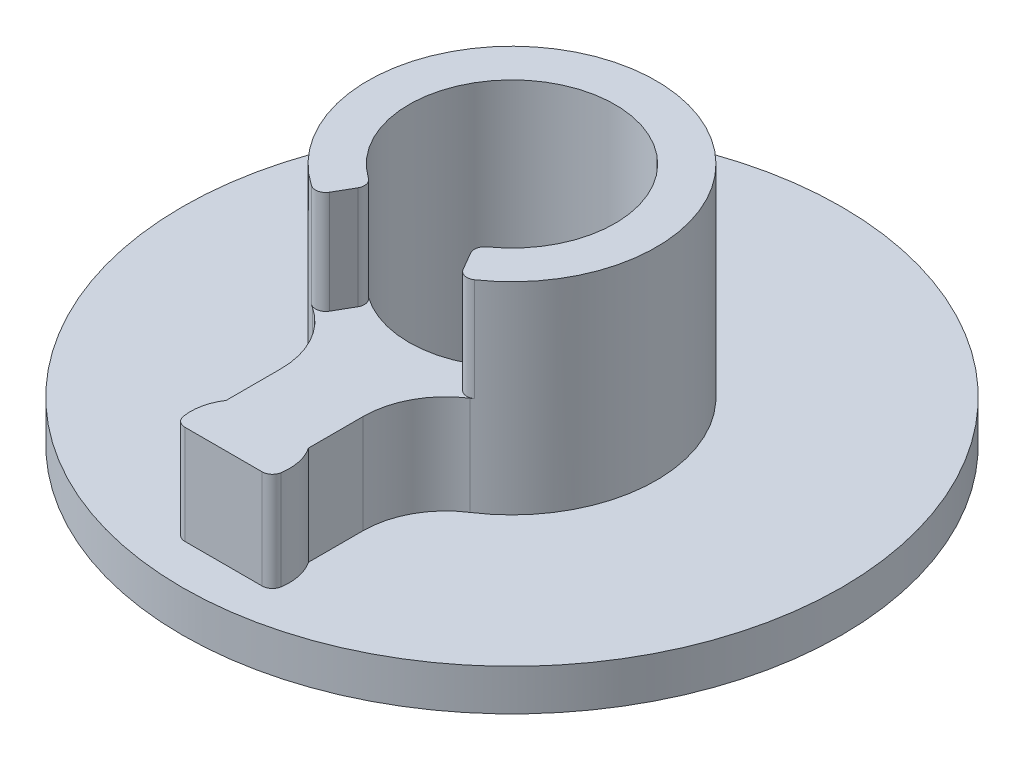
ISO-10303-21;
HEADER;
FILE_DESCRIPTION(('STEP AP214'),'2;1');
FILE_NAME('part.step','',(''),(''),'','','');
FILE_SCHEMA(('AUTOMOTIVE_DESIGN { 1 0 10303 214 1 1 1 1 }'));
ENDSEC;
DATA;
#1=APPLICATION_CONTEXT('core data for automotive mechanical design processes');
#2=APPLICATION_PROTOCOL_DEFINITION('international standard','automotive_design',2000,#1);
#3=PRODUCT_CONTEXT('',#1,'mechanical');
#4=PRODUCT('Part','Part','',(#3));
#5=PRODUCT_RELATED_PRODUCT_CATEGORY('part','',(#4));
#6=PRODUCT_DEFINITION_FORMATION('','',#4);
#7=PRODUCT_DEFINITION_CONTEXT('part definition',#1,'design');
#8=PRODUCT_DEFINITION('design','',#6,#7);
#9=PRODUCT_DEFINITION_SHAPE('','',#8);
#10=(LENGTH_UNIT() NAMED_UNIT(*) SI_UNIT(.MILLI.,.METRE.));
#11=(NAMED_UNIT(*) PLANE_ANGLE_UNIT() SI_UNIT($,.RADIAN.));
#12=(NAMED_UNIT(*) SI_UNIT($,.STERADIAN.) SOLID_ANGLE_UNIT());
#13=UNCERTAINTY_MEASURE_WITH_UNIT(LENGTH_MEASURE(1.E-05),#10,'distance_accuracy_value','');
#14=(GEOMETRIC_REPRESENTATION_CONTEXT(3) GLOBAL_UNCERTAINTY_ASSIGNED_CONTEXT((#13)) GLOBAL_UNIT_ASSIGNED_CONTEXT((#10,
#11,#12)) REPRESENTATION_CONTEXT('',''));
#15=CARTESIAN_POINT('',(0.,0.,0.));
#16=DIRECTION('',(0.,0.,1.));
#17=DIRECTION('',(1.,0.,0.));
#18=AXIS2_PLACEMENT_3D('',#15,#16,#17);
#19=CARTESIAN_POINT('',(0.,-0.1,0.));
#20=DIRECTION('',(0.,-1.,0.));
#21=DIRECTION('',(0.,0.,-1.));
#22=AXIS2_PLACEMENT_3D('',#19,#20,#21);
#23=CYLINDRICAL_SURFACE('',#22,3.25);
#24=CARTESIAN_POINT('',(0.,-0.1,0.));
#25=DIRECTION('',(0.,-1.,0.));
#26=DIRECTION('',(0.,0.,-1.));
#27=AXIS2_PLACEMENT_3D('',#24,#25,#26);
#28=CIRCLE('',#27,3.25);
#29=CARTESIAN_POINT('',(0.,-0.1,-3.25));
#30=VERTEX_POINT('',#29);
#31=EDGE_CURVE('E11',#30,#30,#28,.T.);
#32=ORIENTED_EDGE('',*,*,#31,.T.);
#33=EDGE_LOOP('',(#32));
#34=FACE_BOUND('',#33,.T.);
#35=CARTESIAN_POINT('',(0.,-1.5,0.));
#36=DIRECTION('',(0.,-1.,0.));
#37=DIRECTION('',(0.,0.,-1.));
#38=AXIS2_PLACEMENT_3D('',#35,#36,#37);
#39=CIRCLE('',#38,3.25);
#40=CARTESIAN_POINT('',(0.,-1.5,-3.25));
#41=VERTEX_POINT('',#40);
#42=EDGE_CURVE('E44',#41,#41,#39,.T.);
#43=ORIENTED_EDGE('',*,*,#42,.F.);
#44=EDGE_LOOP('',(#43));
#45=FACE_BOUND('',#44,.T.);
#46=ADVANCED_FACE('F41',(#34,#45),#23,.T.);
#47=CARTESIAN_POINT('',(0.,-0.1,0.));
#48=DIRECTION('',(0.,-1.,0.));
#49=DIRECTION('',(0.,0.,-1.));
#50=AXIS2_PLACEMENT_3D('',#47,#48,#49);
#51=PLANE('',#50);
#52=CARTESIAN_POINT('',(0.,-0.1,0.));
#53=DIRECTION('',(0.,-1.,0.));
#54=DIRECTION('',(0.,0.,-1.));
#55=AXIS2_PLACEMENT_3D('',#52,#53,#54);
#56=CIRCLE('',#55,2.25);
#57=CARTESIAN_POINT('',(0.,-0.1,-2.25));
#58=VERTEX_POINT('',#57);
#59=EDGE_CURVE('E51',#58,#58,#56,.T.);
#60=ORIENTED_EDGE('',*,*,#59,.T.);
#61=EDGE_LOOP('',(#60));
#62=FACE_BOUND('',#61,.T.);
#63=ORIENTED_EDGE('',*,*,#31,.F.);
#64=EDGE_LOOP('',(#63));
#65=FACE_BOUND('',#64,.T.);
#66=ADVANCED_FACE('F59',(#62,#65),#51,.F.);
#67=CARTESIAN_POINT('',(0.,-1.5,0.));
#68=DIRECTION('',(0.,-1.,0.));
#69=DIRECTION('',(0.,0.,-1.));
#70=AXIS2_PLACEMENT_3D('',#67,#68,#69);
#71=PLANE('',#70);
#72=CARTESIAN_POINT('',(0.,-1.5,0.));
#73=DIRECTION('',(0.,-1.,0.));
#74=DIRECTION('',(0.,0.,-1.));
#75=AXIS2_PLACEMENT_3D('',#72,#73,#74);
#76=CIRCLE('',#75,2.25);
#77=CARTESIAN_POINT('',(0.,-1.5,-2.25));
#78=VERTEX_POINT('',#77);
#79=EDGE_CURVE('E53',#78,#78,#76,.T.);
#80=ORIENTED_EDGE('',*,*,#79,.F.);
#81=EDGE_LOOP('',(#80));
#82=FACE_BOUND('',#81,.T.);
#83=ORIENTED_EDGE('',*,*,#42,.T.);
#84=EDGE_LOOP('',(#83));
#85=FACE_BOUND('',#84,.T.);
#86=ADVANCED_FACE('F65',(#82,#85),#71,.T.);
#87=CARTESIAN_POINT('',(0.,-0.1,0.));
#88=DIRECTION('',(0.,-1.,0.));
#89=DIRECTION('',(0.,0.,-1.));
#90=AXIS2_PLACEMENT_3D('',#87,#88,#89);
#91=CYLINDRICAL_SURFACE('',#90,2.25);
#92=ORIENTED_EDGE('',*,*,#59,.F.);
#93=EDGE_LOOP('',(#92));
#94=FACE_BOUND('',#93,.T.);
#95=ORIENTED_EDGE('',*,*,#79,.T.);
#96=EDGE_LOOP('',(#95));
#97=FACE_BOUND('',#96,.T.);
#98=ADVANCED_FACE('F62',(#94,#97),#91,.F.);
#99=CLOSED_SHELL('',(#46,#66,#86,#98));
#100=MANIFOLD_SOLID_BREP('B2',#99);
#101=CARTESIAN_POINT('',(0.,5.9,6.6));
#102=DIRECTION('',(0.,-1.,0.));
#103=DIRECTION('',(0.,0.,-1.));
#104=AXIS2_PLACEMENT_3D('',#101,#102,#103);
#105=CYLINDRICAL_SURFACE('',#104,1.2);
#106=CARTESIAN_POINT('',(0.,3.4,6.6));
#107=DIRECTION('',(0.,1.,0.));
#108=DIRECTION('',(0.,0.,1.));
#109=AXIS2_PLACEMENT_3D('',#106,#107,#108);
#110=CIRCLE('',#109,1.2);
#111=CARTESIAN_POINT('',(1.18494713932381,3.4,6.78947368421053));
#112=VERTEX_POINT('',#111);
#113=CARTESIAN_POINT('',(0.999999999999999,3.4,5.93667504192892));
#114=VERTEX_POINT('',#113);
#115=EDGE_CURVE('E226',#112,#114,#110,.T.);
#116=ORIENTED_EDGE('',*,*,#115,.F.);
#117=DIRECTION('',(0.,-1.,0.));
#118=VECTOR('',#117,1.);
#119=CARTESIAN_POINT('',(1.18494713932381,5.9,6.78947368421053));
#120=LINE('',#119,#118);
#121=CARTESIAN_POINT('',(1.18494713932381,1.,6.78947368421053));
#122=VERTEX_POINT('',#121);
#123=EDGE_CURVE('E280',#112,#122,#120,.T.);
#124=ORIENTED_EDGE('',*,*,#123,.T.);
#125=CARTESIAN_POINT('',(0.,1.,6.6));
#126=DIRECTION('',(0.,1.,0.));
#127=DIRECTION('',(0.,0.,1.));
#128=AXIS2_PLACEMENT_3D('',#125,#126,#127);
#129=CIRCLE('',#128,1.2);
#130=CARTESIAN_POINT('',(0.999999999999999,1.,5.93667504192892));
#131=VERTEX_POINT('',#130);
#132=EDGE_CURVE('E252',#122,#131,#129,.T.);
#133=ORIENTED_EDGE('',*,*,#132,.T.);
#134=DIRECTION('',(0.,-1.,0.));
#135=VECTOR('',#134,1.);
#136=CARTESIAN_POINT('',(0.999999999999999,5.9,5.93667504192892));
#137=LINE('',#136,#135);
#138=EDGE_CURVE('E246',#114,#131,#137,.T.);
#139=ORIENTED_EDGE('',*,*,#138,.F.);
#140=EDGE_LOOP('',(#116,#124,#133,#139));
#141=FACE_BOUND('',#140,.T.);
#142=ADVANCED_FACE('F103',(#141),#105,.T.);
#143=CARTESIAN_POINT('',(0.999999999999999,5.9,5.93667504192892));
#144=DIRECTION('',(-1.,0.,0.));
#145=DIRECTION('',(0.,0.,1.));
#146=AXIS2_PLACEMENT_3D('',#143,#144,#145);
#147=PLANE('',#146);
#148=DIRECTION('',(0.,0.,-1.));
#149=VECTOR('',#148,1.);
#150=CARTESIAN_POINT('',(0.999999999999999,3.4,5.93667504192892));
#151=LINE('',#150,#149);
#152=CARTESIAN_POINT('',(0.999999999999998,3.4,4.60977222864645));
#153=VERTEX_POINT('',#152);
#154=EDGE_CURVE('E230',#114,#153,#151,.T.);
#155=ORIENTED_EDGE('',*,*,#154,.F.);
#156=ORIENTED_EDGE('',*,*,#138,.T.);
#157=DIRECTION('',(0.,0.,-1.));
#158=VECTOR('',#157,1.);
#159=CARTESIAN_POINT('',(0.999999999999999,1.,5.93667504192892));
#160=LINE('',#159,#158);
#161=CARTESIAN_POINT('',(0.999999999999999,1.,4.60977222864645));
#162=VERTEX_POINT('',#161);
#163=EDGE_CURVE('E431',#131,#162,#160,.T.);
#164=ORIENTED_EDGE('',*,*,#163,.T.);
#165=DIRECTION('',(0.,-1.,0.));
#166=VECTOR('',#165,1.);
#167=CARTESIAN_POINT('',(0.999999999999999,5.9,4.60977222864645));
#168=LINE('',#167,#166);
#169=EDGE_CURVE('E248',#153,#162,#168,.T.);
#170=ORIENTED_EDGE('',*,*,#169,.F.);
#171=EDGE_LOOP('',(#155,#156,#164,#170));
#172=FACE_BOUND('',#171,.T.);
#173=ADVANCED_FACE('F244',(#172),#147,.F.);
#174=CARTESIAN_POINT('',(-0.999999999999999,5.9,5.93667504192892));
#175=DIRECTION('',(1.,0.,0.));
#176=DIRECTION('',(0.,0.,-1.));
#177=AXIS2_PLACEMENT_3D('',#174,#175,#176);
#178=PLANE('',#177);
#179=DIRECTION('',(0.,0.,1.));
#180=VECTOR('',#179,1.);
#181=CARTESIAN_POINT('',(-0.999999999999999,3.4,5.93667504192892));
#182=LINE('',#181,#180);
#183=CARTESIAN_POINT('',(-0.999999999999999,3.4,4.60977222864645));
#184=VERTEX_POINT('',#183);
#185=CARTESIAN_POINT('',(-0.999999999999999,3.4,5.93667504192892));
#186=VERTEX_POINT('',#185);
#187=EDGE_CURVE('E407',#184,#186,#182,.T.);
#188=ORIENTED_EDGE('',*,*,#187,.F.);
#189=DIRECTION('',(0.,-1.,0.));
#190=VECTOR('',#189,1.);
#191=CARTESIAN_POINT('',(-0.999999999999999,5.9,4.60977222864645));
#192=LINE('',#191,#190);
#193=CARTESIAN_POINT('',(-0.999999999999999,1.,4.60977222864645));
#194=VERTEX_POINT('',#193);
#195=EDGE_CURVE('E451',#184,#194,#192,.T.);
#196=ORIENTED_EDGE('',*,*,#195,.T.);
#197=DIRECTION('',(0.,0.,1.));
#198=VECTOR('',#197,1.);
#199=CARTESIAN_POINT('',(-0.999999999999999,1.,5.93667504192892));
#200=LINE('',#199,#198);
#201=CARTESIAN_POINT('',(-0.999999999999999,1.,5.93667504192892));
#202=VERTEX_POINT('',#201);
#203=EDGE_CURVE('E442',#194,#202,#200,.T.);
#204=ORIENTED_EDGE('',*,*,#203,.T.);
#205=DIRECTION('',(0.,-1.,0.));
#206=VECTOR('',#205,1.);
#207=CARTESIAN_POINT('',(-0.999999999999999,5.9,5.93667504192892));
#208=LINE('',#207,#206);
#209=EDGE_CURVE('E428',#186,#202,#208,.T.);
#210=ORIENTED_EDGE('',*,*,#209,.F.);
#211=EDGE_LOOP('',(#188,#196,#204,#210));
#212=FACE_BOUND('',#211,.T.);
#213=ADVANCED_FACE('F348',(#212),#178,.F.);
#214=CARTESIAN_POINT('',(0.,5.9,6.6));
#215=DIRECTION('',(0.,-1.,0.));
#216=DIRECTION('',(0.,0.,-1.));
#217=AXIS2_PLACEMENT_3D('',#214,#215,#216);
#218=CYLINDRICAL_SURFACE('',#217,1.2);
#219=CARTESIAN_POINT('',(0.,1.,6.6));
#220=DIRECTION('',(0.,1.,0.));
#221=DIRECTION('',(0.,0.,1.));
#222=AXIS2_PLACEMENT_3D('',#219,#220,#221);
#223=CIRCLE('',#222,1.2);
#224=CARTESIAN_POINT('',(-1.18494713932381,1.,6.78947368421053));
#225=VERTEX_POINT('',#224);
#226=EDGE_CURVE('E445',#202,#225,#223,.T.);
#227=ORIENTED_EDGE('',*,*,#226,.T.);
#228=DIRECTION('',(0.,-1.,0.));
#229=VECTOR('',#228,1.);
#230=CARTESIAN_POINT('',(-1.18494713932381,5.9,6.78947368421053));
#231=LINE('',#230,#229);
#232=CARTESIAN_POINT('',(-1.18494713932381,3.4,6.78947368421053));
#233=VERTEX_POINT('',#232);
#234=EDGE_CURVE('E275',#225,#233,#231,.F.);
#235=ORIENTED_EDGE('',*,*,#234,.T.);
#236=CARTESIAN_POINT('',(0.,3.4,6.6));
#237=DIRECTION('',(0.,1.,0.));
#238=DIRECTION('',(0.,0.,1.));
#239=AXIS2_PLACEMENT_3D('',#236,#237,#238);
#240=CIRCLE('',#239,1.2);
#241=EDGE_CURVE('E416',#186,#233,#240,.T.);
#242=ORIENTED_EDGE('',*,*,#241,.F.);
#243=ORIENTED_EDGE('',*,*,#209,.T.);
#244=EDGE_LOOP('',(#227,#235,#242,#243));
#245=FACE_BOUND('',#244,.T.);
#246=ADVANCED_FACE('F509',(#245),#218,.T.);
#247=CARTESIAN_POINT('',(1.13137084989848,5.9,7.));
#248=DIRECTION('',(0.,0.,-1.));
#249=DIRECTION('',(-1.,0.,0.));
#250=AXIS2_PLACEMENT_3D('',#247,#248,#249);
#251=PLANE('',#250);
#252=DIRECTION('',(1.,0.,0.));
#253=VECTOR('',#252,1.);
#254=CARTESIAN_POINT('',(-1.13137084989847,3.4,7.));
#255=LINE('',#254,#253);
#256=CARTESIAN_POINT('',(-0.938083151964683,3.4,7.));
#257=VERTEX_POINT('',#256);
#258=CARTESIAN_POINT('',(0.938083151964685,3.4,7.));
#259=VERTEX_POINT('',#258);
#260=EDGE_CURVE('E239',#257,#259,#255,.T.);
#261=ORIENTED_EDGE('',*,*,#260,.F.);
#262=DIRECTION('',(0.,-1.,0.));
#263=VECTOR('',#262,1.);
#264=CARTESIAN_POINT('',(-0.938083151964683,5.9,7.));
#265=LINE('',#264,#263);
#266=CARTESIAN_POINT('',(-0.938083151964682,1.,7.));
#267=VERTEX_POINT('',#266);
#268=EDGE_CURVE('E272',#257,#267,#265,.T.);
#269=ORIENTED_EDGE('',*,*,#268,.T.);
#270=DIRECTION('',(1.,0.,0.));
#271=VECTOR('',#270,1.);
#272=CARTESIAN_POINT('',(1.13137084989848,1.,7.));
#273=LINE('',#272,#271);
#274=CARTESIAN_POINT('',(0.938083151964685,1.,7.));
#275=VERTEX_POINT('',#274);
#276=EDGE_CURVE('E429',#267,#275,#273,.T.);
#277=ORIENTED_EDGE('',*,*,#276,.T.);
#278=DIRECTION('',(0.,-1.,0.));
#279=VECTOR('',#278,1.);
#280=CARTESIAN_POINT('',(0.938083151964685,5.9,7.));
#281=LINE('',#280,#279);
#282=EDGE_CURVE('E270',#275,#259,#281,.F.);
#283=ORIENTED_EDGE('',*,*,#282,.T.);
#284=EDGE_LOOP('',(#261,#269,#277,#283));
#285=FACE_BOUND('',#284,.T.);
#286=ADVANCED_FACE('F485',(#285),#251,.F.);
#287=CARTESIAN_POINT('',(0.,0.,0.));
#288=DIRECTION('',(0.,1.,0.));
#289=DIRECTION('',(0.,0.,1.));
#290=AXIS2_PLACEMENT_3D('',#287,#288,#289);
#291=PLANE('',#290);
#292=CARTESIAN_POINT('',(0.,0.,0.));
#293=DIRECTION('',(0.,1.,0.));
#294=DIRECTION('',(0.,0.,1.));
#295=AXIS2_PLACEMENT_3D('',#292,#293,#294);
#296=CIRCLE('',#295,2.5);
#297=CARTESIAN_POINT('',(0.,0.,2.5));
#298=VERTEX_POINT('',#297);
#299=EDGE_CURVE('E253',#298,#298,#296,.T.);
#300=ORIENTED_EDGE('',*,*,#299,.T.);
#301=EDGE_LOOP('',(#300));
#302=FACE_BOUND('',#301,.T.);
#303=CARTESIAN_POINT('',(0.,0.,0.));
#304=DIRECTION('',(0.,-1.,0.));
#305=DIRECTION('',(0.,0.,-1.));
#306=AXIS2_PLACEMENT_3D('',#303,#304,#305);
#307=CIRCLE('',#306,4.);
#308=CARTESIAN_POINT('',(0.,0.,-4.));
#309=VERTEX_POINT('',#308);
#310=EDGE_CURVE('E409',#309,#309,#307,.T.);
#311=ORIENTED_EDGE('',*,*,#310,.T.);
#312=EDGE_LOOP('',(#311));
#313=FACE_BOUND('',#312,.T.);
#314=ADVANCED_FACE('F362',(#302,#313),#291,.F.);
#315=CARTESIAN_POINT('',(0.,1.,0.));
#316=DIRECTION('',(0.,1.,0.));
#317=DIRECTION('',(0.,0.,1.));
#318=AXIS2_PLACEMENT_3D('',#315,#316,#317);
#319=PLANE('',#318);
#320=CARTESIAN_POINT('',(0.,1.,0.));
#321=DIRECTION('',(0.,1.,0.));
#322=DIRECTION('',(0.,0.,1.));
#323=AXIS2_PLACEMENT_3D('',#320,#321,#322);
#324=CIRCLE('',#323,8.);
#325=CARTESIAN_POINT('',(0.,1.,8.));
#326=VERTEX_POINT('',#325);
#327=EDGE_CURVE('E262',#326,#326,#324,.T.);
#328=ORIENTED_EDGE('',*,*,#327,.T.);
#329=EDGE_LOOP('',(#328));
#330=FACE_BOUND('',#329,.T.);
#331=ORIENTED_EDGE('',*,*,#163,.F.);
#332=ORIENTED_EDGE('',*,*,#132,.F.);
#333=CARTESIAN_POINT('',(0.938083151964685,1.,6.75));
#334=DIRECTION('',(0.,1.,0.));
#335=DIRECTION('',(0.,0.,1.));
#336=AXIS2_PLACEMENT_3D('',#333,#334,#335);
#337=CIRCLE('',#336,0.25);
#338=EDGE_CURVE('E319',#122,#275,#337,.F.);
#339=ORIENTED_EDGE('',*,*,#338,.T.);
#340=ORIENTED_EDGE('',*,*,#276,.F.);
#341=CARTESIAN_POINT('',(-0.938083151964683,1.,6.75));
#342=DIRECTION('',(0.,1.,0.));
#343=DIRECTION('',(0.,0.,1.));
#344=AXIS2_PLACEMENT_3D('',#341,#342,#343);
#345=CIRCLE('',#344,0.25);
#346=EDGE_CURVE('E317',#267,#225,#345,.F.);
#347=ORIENTED_EDGE('',*,*,#346,.T.);
#348=ORIENTED_EDGE('',*,*,#226,.F.);
#349=ORIENTED_EDGE('',*,*,#203,.F.);
#350=CARTESIAN_POINT('',(-3.,1.,4.60977222864645));
#351=DIRECTION('',(0.,-1.,0.));
#352=DIRECTION('',(0.,0.,-1.));
#353=AXIS2_PLACEMENT_3D('',#350,#351,#352);
#354=CIRCLE('',#353,2.);
#355=CARTESIAN_POINT('',(-1.90909090909091,1.,2.93349141822956));
#356=VERTEX_POINT('',#355);
#357=EDGE_CURVE('E439',#356,#194,#354,.T.);
#358=ORIENTED_EDGE('',*,*,#357,.F.);
#359=CARTESIAN_POINT('',(0.,1.,0.));
#360=DIRECTION('',(0.,1.,0.));
#361=DIRECTION('',(0.,0.,1.));
#362=AXIS2_PLACEMENT_3D('',#359,#360,#361);
#363=CIRCLE('',#362,3.5);
#364=CARTESIAN_POINT('',(1.90909090909091,1.,2.93349141822956));
#365=VERTEX_POINT('',#364);
#366=EDGE_CURVE('E436',#365,#356,#363,.T.);
#367=ORIENTED_EDGE('',*,*,#366,.F.);
#368=CARTESIAN_POINT('',(3.,1.,4.60977222864645));
#369=DIRECTION('',(0.,-1.,0.));
#370=DIRECTION('',(0.,0.,1.));
#371=AXIS2_PLACEMENT_3D('',#368,#369,#370);
#372=CIRCLE('',#371,2.);
#373=EDGE_CURVE('E433',#162,#365,#372,.T.);
#374=ORIENTED_EDGE('',*,*,#373,.F.);
#375=EDGE_LOOP('',(#331,#332,#339,#340,#347,#348,#349,#358,#367,#374));
#376=FACE_BOUND('',#375,.T.);
#377=ADVANCED_FACE('F358',(#330,#376),#319,.T.);
#378=CARTESIAN_POINT('',(0.,0.,0.));
#379=DIRECTION('',(0.,1.,0.));
#380=DIRECTION('',(0.,0.,1.));
#381=AXIS2_PLACEMENT_3D('',#378,#379,#380);
#382=CIRCLE('',#381,5.4);
#383=CARTESIAN_POINT('',(0.,0.,5.4));
#384=VERTEX_POINT('',#383);
#385=EDGE_CURVE('E265',#384,#384,#382,.F.);
#386=ORIENTED_EDGE('',*,*,#385,.F.);
#387=EDGE_LOOP('',(#386));
#388=FACE_BOUND('',#387,.T.);
#389=CARTESIAN_POINT('',(0.,0.,0.));
#390=DIRECTION('',(0.,1.,0.));
#391=DIRECTION('',(0.,0.,1.));
#392=AXIS2_PLACEMENT_3D('',#389,#390,#391);
#393=CIRCLE('',#392,8.);
#394=CARTESIAN_POINT('',(0.,0.,8.));
#395=VERTEX_POINT('',#394);
#396=EDGE_CURVE('E256',#395,#395,#393,.T.);
#397=ORIENTED_EDGE('',*,*,#396,.F.);
#398=EDGE_LOOP('',(#397));
#399=FACE_BOUND('',#398,.T.);
#400=ADVANCED_FACE('F361',(#388,#399),#291,.F.);
#401=CARTESIAN_POINT('',(0.,1.,0.));
#402=DIRECTION('',(0.,-1.,0.));
#403=DIRECTION('',(0.,0.,-1.));
#404=AXIS2_PLACEMENT_3D('',#401,#402,#403);
#405=CYLINDRICAL_SURFACE('',#404,8.);
#406=ORIENTED_EDGE('',*,*,#327,.F.);
#407=EDGE_LOOP('',(#406));
#408=FACE_BOUND('',#407,.T.);
#409=ORIENTED_EDGE('',*,*,#396,.T.);
#410=EDGE_LOOP('',(#409));
#411=FACE_BOUND('',#410,.T.);
#412=ADVANCED_FACE('F356',(#408,#411),#405,.T.);
#413=CARTESIAN_POINT('',(0.,1.,0.));
#414=DIRECTION('',(0.,-1.,0.));
#415=DIRECTION('',(0.,0.,-1.));
#416=AXIS2_PLACEMENT_3D('',#413,#414,#415);
#417=CYLINDRICAL_SURFACE('',#416,2.5);
#418=CARTESIAN_POINT('',(0.,5.9,0.));
#419=DIRECTION('',(0.,1.,0.));
#420=DIRECTION('',(0.,0.,1.));
#421=AXIS2_PLACEMENT_3D('',#418,#419,#420);
#422=CIRCLE('',#421,2.5);
#423=CARTESIAN_POINT('',(1.44164794973548,5.9,2.04246204102389));
#424=VERTEX_POINT('',#423);
#425=CARTESIAN_POINT('',(-1.44164794973548,5.9,2.04246204102389));
#426=VERTEX_POINT('',#425);
#427=EDGE_CURVE('E420',#424,#426,#422,.T.);
#428=ORIENTED_EDGE('',*,*,#427,.T.);
#429=DIRECTION('',(0.,-1.,0.));
#430=VECTOR('',#429,1.);
#431=CARTESIAN_POINT('',(-1.44164794973548,1.,2.04246204102389));
#432=LINE('',#431,#430);
#433=CARTESIAN_POINT('',(-1.44164794973548,3.4,2.04246204102389));
#434=VERTEX_POINT('',#433);
#435=EDGE_CURVE('E310',#426,#434,#432,.T.);
#436=ORIENTED_EDGE('',*,*,#435,.T.);
#437=CARTESIAN_POINT('',(0.,3.4,0.));
#438=DIRECTION('',(0.,-1.,0.));
#439=DIRECTION('',(0.,0.,1.));
#440=AXIS2_PLACEMENT_3D('',#437,#438,#439);
#441=CIRCLE('',#440,2.5);
#442=CARTESIAN_POINT('',(1.44164794973548,3.4,2.04246204102389));
#443=VERTEX_POINT('',#442);
#444=EDGE_CURVE('E126',#443,#434,#441,.T.);
#445=ORIENTED_EDGE('',*,*,#444,.F.);
#446=DIRECTION('',(0.,-1.,0.));
#447=VECTOR('',#446,1.);
#448=CARTESIAN_POINT('',(1.44164794973548,1.,2.04246204102389));
#449=LINE('',#448,#447);
#450=EDGE_CURVE('E307',#443,#424,#449,.F.);
#451=ORIENTED_EDGE('',*,*,#450,.T.);
#452=EDGE_LOOP('',(#428,#436,#445,#451));
#453=FACE_BOUND('',#452,.T.);
#454=ORIENTED_EDGE('',*,*,#299,.F.);
#455=EDGE_LOOP('',(#454));
#456=FACE_BOUND('',#455,.T.);
#457=ADVANCED_FACE('F352',(#453,#456),#417,.F.);
#458=CARTESIAN_POINT('',(0.,5.9,6.6));
#459=DIRECTION('',(0.,1.,0.));
#460=DIRECTION('',(0.,0.,1.));
#461=AXIS2_PLACEMENT_3D('',#458,#459,#460);
#462=PLANE('',#461);
#463=CARTESIAN_POINT('',(0.,5.9,0.));
#464=DIRECTION('',(0.,1.,0.));
#465=DIRECTION('',(0.,0.,1.));
#466=AXIS2_PLACEMENT_3D('',#463,#464,#465);
#467=CIRCLE('',#466,3.5);
#468=CARTESIAN_POINT('',(1.97797548905178,5.9,2.88749250470203));
#469=VERTEX_POINT('',#468);
#470=CARTESIAN_POINT('',(-1.97797548905177,5.9,2.88749250470203));
#471=VERTEX_POINT('',#470);
#472=EDGE_CURVE('E425',#469,#471,#467,.T.);
#473=ORIENTED_EDGE('',*,*,#472,.T.);
#474=CARTESIAN_POINT('',(-1.83669152554808,5.9,2.68124304008046));
#475=DIRECTION('',(0.,1.,0.));
#476=DIRECTION('',(0.,0.,1.));
#477=AXIS2_PLACEMENT_3D('',#474,#475,#476);
#478=CIRCLE('',#477,0.25);
#479=CARTESIAN_POINT('',(-1.62018517460197,5.9,2.80624304008046));
#480=VERTEX_POINT('',#479);
#481=EDGE_CURVE('E300',#471,#480,#478,.T.);
#482=ORIENTED_EDGE('',*,*,#481,.T.);
#483=DIRECTION('',(-0.500000000000001,0.,0.866025403784438));
#484=VECTOR('',#483,1.);
#485=CARTESIAN_POINT('',(-1.25,5.9,2.1650635094611));
#486=LINE('',#485,#484);
#487=CARTESIAN_POINT('',(-1.36930639376292,5.9,2.37170824512628));
#488=VERTEX_POINT('',#487);
#489=EDGE_CURVE('E413',#488,#480,#486,.T.);
#490=ORIENTED_EDGE('',*,*,#489,.F.);
#491=CARTESIAN_POINT('',(-1.58581274470903,5.9,2.24670824512628));
#492=DIRECTION('',(0.,1.,0.));
#493=DIRECTION('',(0.,0.,1.));
#494=AXIS2_PLACEMENT_3D('',#491,#492,#493);
#495=CIRCLE('',#494,0.25);
#496=EDGE_CURVE('E298',#488,#426,#495,.T.);
#497=ORIENTED_EDGE('',*,*,#496,.T.);
#498=ORIENTED_EDGE('',*,*,#427,.F.);
#499=CARTESIAN_POINT('',(1.58581274470903,5.9,2.24670824512628));
#500=DIRECTION('',(0.,1.,0.));
#501=DIRECTION('',(0.,0.,1.));
#502=AXIS2_PLACEMENT_3D('',#499,#500,#501);
#503=CIRCLE('',#502,0.25);
#504=CARTESIAN_POINT('',(1.36930639376292,5.9,2.37170824512628));
#505=VERTEX_POINT('',#504);
#506=EDGE_CURVE('E296',#424,#505,#503,.T.);
#507=ORIENTED_EDGE('',*,*,#506,.T.);
#508=DIRECTION('',(-0.500000000000001,0.,-0.866025403784438));
#509=VECTOR('',#508,1.);
#510=CARTESIAN_POINT('',(1.25,5.9,2.16506350946109));
#511=LINE('',#510,#509);
#512=CARTESIAN_POINT('',(1.62018517460197,5.9,2.80624304008045));
#513=VERTEX_POINT('',#512);
#514=EDGE_CURVE('E410',#513,#505,#511,.T.);
#515=ORIENTED_EDGE('',*,*,#514,.F.);
#516=CARTESIAN_POINT('',(1.83669152554808,5.9,2.68124304008045));
#517=DIRECTION('',(0.,1.,0.));
#518=DIRECTION('',(0.,0.,1.));
#519=AXIS2_PLACEMENT_3D('',#516,#517,#518);
#520=CIRCLE('',#519,0.25);
#521=EDGE_CURVE('E294',#513,#469,#520,.T.);
#522=ORIENTED_EDGE('',*,*,#521,.T.);
#523=EDGE_LOOP('',(#473,#482,#490,#497,#498,#507,#515,#522));
#524=FACE_BOUND('',#523,.T.);
#525=ADVANCED_FACE('F355',(#524),#462,.T.);
#526=CARTESIAN_POINT('',(3.,5.9,4.60977222864645));
#527=DIRECTION('',(0.,-1.,0.));
#528=DIRECTION('',(0.,0.,-1.));
#529=AXIS2_PLACEMENT_3D('',#526,#527,#528);
#530=CYLINDRICAL_SURFACE('',#529,2.);
#531=DIRECTION('',(0.,-1.,0.));
#532=VECTOR('',#531,1.);
#533=CARTESIAN_POINT('',(1.90909090909091,5.9,2.93349141822956));
#534=LINE('',#533,#532);
#535=CARTESIAN_POINT('',(1.90909090909091,3.4,2.93349141822956));
#536=VERTEX_POINT('',#535);
#537=EDGE_CURVE('E258',#536,#365,#534,.T.);
#538=ORIENTED_EDGE('',*,*,#537,.F.);
#539=CARTESIAN_POINT('',(3.,3.4,4.60977222864645));
#540=DIRECTION('',(0.,-1.,0.));
#541=DIRECTION('',(0.,0.,1.));
#542=AXIS2_PLACEMENT_3D('',#539,#540,#541);
#543=CIRCLE('',#542,2.);
#544=EDGE_CURVE('E249',#153,#536,#543,.T.);
#545=ORIENTED_EDGE('',*,*,#544,.F.);
#546=ORIENTED_EDGE('',*,*,#169,.T.);
#547=ORIENTED_EDGE('',*,*,#373,.T.);
#548=EDGE_LOOP('',(#538,#545,#546,#547));
#549=FACE_BOUND('',#548,.T.);
#550=ADVANCED_FACE('F462',(#549),#530,.F.);
#551=CARTESIAN_POINT('',(0.,5.9,0.));
#552=DIRECTION('',(0.,-1.,0.));
#553=DIRECTION('',(0.,0.,-1.));
#554=AXIS2_PLACEMENT_3D('',#551,#552,#553);
#555=CYLINDRICAL_SURFACE('',#554,3.5);
#556=CARTESIAN_POINT('',(0.,3.4,0.));
#557=DIRECTION('',(0.,1.,0.));
#558=DIRECTION('',(0.,0.,1.));
#559=AXIS2_PLACEMENT_3D('',#556,#557,#558);
#560=CIRCLE('',#559,3.5);
#561=CARTESIAN_POINT('',(-1.90909090909091,3.4,2.93349141822956));
#562=VERTEX_POINT('',#561);
#563=CARTESIAN_POINT('',(-1.97797548905177,3.4,2.88749250470203));
#564=VERTEX_POINT('',#563);
#565=EDGE_CURVE('E288',#562,#564,#560,.F.);
#566=ORIENTED_EDGE('',*,*,#565,.T.);
#567=DIRECTION('',(0.,-1.,0.));
#568=VECTOR('',#567,1.);
#569=CARTESIAN_POINT('',(-1.97797548905177,5.9,2.88749250470203));
#570=LINE('',#569,#568);
#571=EDGE_CURVE('E291',#564,#471,#570,.F.);
#572=ORIENTED_EDGE('',*,*,#571,.T.);
#573=ORIENTED_EDGE('',*,*,#472,.F.);
#574=DIRECTION('',(0.,-1.,0.));
#575=VECTOR('',#574,1.);
#576=CARTESIAN_POINT('',(1.97797548905178,5.9,2.88749250470203));
#577=LINE('',#576,#575);
#578=CARTESIAN_POINT('',(1.97797548905178,3.4,2.88749250470203));
#579=VERTEX_POINT('',#578);
#580=EDGE_CURVE('E285',#469,#579,#577,.T.);
#581=ORIENTED_EDGE('',*,*,#580,.T.);
#582=CARTESIAN_POINT('',(0.,3.4,0.));
#583=DIRECTION('',(0.,1.,0.));
#584=DIRECTION('',(0.,0.,1.));
#585=AXIS2_PLACEMENT_3D('',#582,#583,#584);
#586=CIRCLE('',#585,3.5);
#587=EDGE_CURVE('E282',#579,#536,#586,.F.);
#588=ORIENTED_EDGE('',*,*,#587,.T.);
#589=ORIENTED_EDGE('',*,*,#537,.T.);
#590=ORIENTED_EDGE('',*,*,#366,.T.);
#591=DIRECTION('',(0.,-1.,0.));
#592=VECTOR('',#591,1.);
#593=CARTESIAN_POINT('',(-1.90909090909091,5.9,2.93349141822956));
#594=LINE('',#593,#592);
#595=EDGE_CURVE('E453',#562,#356,#594,.T.);
#596=ORIENTED_EDGE('',*,*,#595,.F.);
#597=EDGE_LOOP('',(#566,#572,#573,#581,#588,#589,#590,#596));
#598=FACE_BOUND('',#597,.T.);
#599=ADVANCED_FACE('F456',(#598),#555,.T.);
#600=CARTESIAN_POINT('',(-3.,5.9,4.60977222864645));
#601=DIRECTION('',(0.,-1.,0.));
#602=DIRECTION('',(0.,0.,-1.));
#603=AXIS2_PLACEMENT_3D('',#600,#601,#602);
#604=CYLINDRICAL_SURFACE('',#603,2.);
#605=CARTESIAN_POINT('',(-3.,3.4,4.60977222864645));
#606=DIRECTION('',(0.,-1.,0.));
#607=DIRECTION('',(0.,0.,1.));
#608=AXIS2_PLACEMENT_3D('',#605,#606,#607);
#609=CIRCLE('',#608,2.);
#610=EDGE_CURVE('E118',#562,#184,#609,.T.);
#611=ORIENTED_EDGE('',*,*,#610,.F.);
#612=ORIENTED_EDGE('',*,*,#595,.T.);
#613=ORIENTED_EDGE('',*,*,#357,.T.);
#614=ORIENTED_EDGE('',*,*,#195,.F.);
#615=EDGE_LOOP('',(#611,#612,#613,#614));
#616=FACE_BOUND('',#615,.T.);
#617=ADVANCED_FACE('F466',(#616),#604,.F.);
#618=CARTESIAN_POINT('',(0.,-1.5,0.));
#619=DIRECTION('',(0.,-1.,0.));
#620=DIRECTION('',(0.,0.,-1.));
#621=AXIS2_PLACEMENT_3D('',#618,#619,#620);
#622=PLANE('',#621);
#623=CARTESIAN_POINT('',(0.,-1.5,0.));
#624=DIRECTION('',(0.,-1.,0.));
#625=DIRECTION('',(0.,0.,-1.));
#626=AXIS2_PLACEMENT_3D('',#623,#624,#625);
#627=CIRCLE('',#626,5.28452994616207);
#628=CARTESIAN_POINT('',(0.,-1.5,-5.28452994616207));
#629=VERTEX_POINT('',#628);
#630=EDGE_CURVE('E111',#629,#629,#627,.T.);
#631=ORIENTED_EDGE('',*,*,#630,.T.);
#632=EDGE_LOOP('',(#631));
#633=FACE_BOUND('',#632,.T.);
#634=CARTESIAN_POINT('',(0.,-1.5,0.));
#635=DIRECTION('',(0.,-1.,0.));
#636=DIRECTION('',(0.,0.,-1.));
#637=AXIS2_PLACEMENT_3D('',#634,#635,#636);
#638=CIRCLE('',#637,4.);
#639=CARTESIAN_POINT('',(0.,-1.5,-4.));
#640=VERTEX_POINT('',#639);
#641=EDGE_CURVE('E417',#640,#640,#638,.T.);
#642=ORIENTED_EDGE('',*,*,#641,.F.);
#643=EDGE_LOOP('',(#642));
#644=FACE_BOUND('',#643,.T.);
#645=ADVANCED_FACE('F331',(#633,#644),#622,.T.);
#646=CARTESIAN_POINT('',(0.,-1.5,0.));
#647=DIRECTION('',(0.,1.,0.));
#648=DIRECTION('',(0.,0.,1.));
#649=AXIS2_PLACEMENT_3D('',#646,#647,#648);
#650=CYLINDRICAL_SURFACE('',#649,5.4);
#651=CARTESIAN_POINT('',(0.,-1.3,0.));
#652=DIRECTION('',(0.,-1.,0.));
#653=DIRECTION('',(0.,0.,-1.));
#654=AXIS2_PLACEMENT_3D('',#651,#652,#653);
#655=CIRCLE('',#654,5.4);
#656=CARTESIAN_POINT('',(0.,-1.3,-5.4));
#657=VERTEX_POINT('',#656);
#658=EDGE_CURVE('E39',#657,#657,#655,.F.);
#659=ORIENTED_EDGE('',*,*,#658,.T.);
#660=EDGE_LOOP('',(#659));
#661=FACE_BOUND('',#660,.T.);
#662=ORIENTED_EDGE('',*,*,#385,.T.);
#663=EDGE_LOOP('',(#662));
#664=FACE_BOUND('',#663,.T.);
#665=ADVANCED_FACE('F490',(#661,#664),#650,.T.);
#666=CARTESIAN_POINT('',(0.,-1.5,0.));
#667=DIRECTION('',(0.,1.,0.));
#668=DIRECTION('',(0.,0.,1.));
#669=AXIS2_PLACEMENT_3D('',#666,#667,#668);
#670=CYLINDRICAL_SURFACE('',#669,4.);
#671=ORIENTED_EDGE('',*,*,#641,.T.);
#672=EDGE_LOOP('',(#671));
#673=FACE_BOUND('',#672,.T.);
#674=ORIENTED_EDGE('',*,*,#310,.F.);
#675=EDGE_LOOP('',(#674));
#676=FACE_BOUND('',#675,.T.);
#677=ADVANCED_FACE('F488',(#673,#676),#670,.F.);
#678=CARTESIAN_POINT('',(-1.25,3.4,2.1650635094611));
#679=DIRECTION('',(-0.866025403784438,0.,-0.500000000000001));
#680=DIRECTION('',(-0.500000000000001,0.,0.866025403784438));
#681=AXIS2_PLACEMENT_3D('',#678,#679,#680);
#682=PLANE('',#681);
#683=ORIENTED_EDGE('',*,*,#489,.T.);
#684=DIRECTION('',(0.,-1.,0.));
#685=VECTOR('',#684,1.);
#686=CARTESIAN_POINT('',(-1.62018517460197,3.4,2.80624304008046));
#687=LINE('',#686,#685);
#688=CARTESIAN_POINT('',(-1.62018517460197,3.4,2.80624304008046));
#689=VERTEX_POINT('',#688);
#690=EDGE_CURVE('E305',#480,#689,#687,.T.);
#691=ORIENTED_EDGE('',*,*,#690,.T.);
#692=DIRECTION('',(-0.500000000000001,0.,0.866025403784438));
#693=VECTOR('',#692,1.);
#694=CARTESIAN_POINT('',(-1.25,3.4,2.1650635094611));
#695=LINE('',#694,#693);
#696=CARTESIAN_POINT('',(-1.36930639376292,3.4,2.37170824512628));
#697=VERTEX_POINT('',#696);
#698=EDGE_CURVE('E400',#697,#689,#695,.T.);
#699=ORIENTED_EDGE('',*,*,#698,.F.);
#700=DIRECTION('',(0.,1.,0.));
#701=VECTOR('',#700,1.);
#702=CARTESIAN_POINT('',(-1.36930639376292,5.9,2.37170824512628));
#703=LINE('',#702,#701);
#704=EDGE_CURVE('E302',#697,#488,#703,.T.);
#705=ORIENTED_EDGE('',*,*,#704,.T.);
#706=EDGE_LOOP('',(#683,#691,#699,#705));
#707=FACE_BOUND('',#706,.T.);
#708=ADVANCED_FACE('F474',(#707),#682,.F.);
#709=CARTESIAN_POINT('',(1.25,3.4,2.16506350946109));
#710=DIRECTION('',(0.866025403784438,0.,-0.500000000000001));
#711=DIRECTION('',(-0.500000000000001,0.,-0.866025403784438));
#712=AXIS2_PLACEMENT_3D('',#709,#710,#711);
#713=PLANE('',#712);
#714=ORIENTED_EDGE('',*,*,#514,.T.);
#715=DIRECTION('',(0.,1.,0.));
#716=VECTOR('',#715,1.);
#717=CARTESIAN_POINT('',(1.36930639376292,3.4,2.37170824512628));
#718=LINE('',#717,#716);
#719=CARTESIAN_POINT('',(1.36930639376292,3.4,2.37170824512628));
#720=VERTEX_POINT('',#719);
#721=EDGE_CURVE('E315',#505,#720,#718,.F.);
#722=ORIENTED_EDGE('',*,*,#721,.T.);
#723=DIRECTION('',(-0.500000000000001,0.,-0.866025403784438));
#724=VECTOR('',#723,1.);
#725=CARTESIAN_POINT('',(1.25,3.4,2.16506350946109));
#726=LINE('',#725,#724);
#727=CARTESIAN_POINT('',(1.62018517460197,3.4,2.80624304008045));
#728=VERTEX_POINT('',#727);
#729=EDGE_CURVE('E395',#728,#720,#726,.T.);
#730=ORIENTED_EDGE('',*,*,#729,.F.);
#731=DIRECTION('',(0.,-1.,0.));
#732=VECTOR('',#731,1.);
#733=CARTESIAN_POINT('',(1.62018517460197,3.4,2.80624304008045));
#734=LINE('',#733,#732);
#735=EDGE_CURVE('E312',#728,#513,#734,.F.);
#736=ORIENTED_EDGE('',*,*,#735,.T.);
#737=EDGE_LOOP('',(#714,#722,#730,#736));
#738=FACE_BOUND('',#737,.T.);
#739=ADVANCED_FACE('F497',(#738),#713,.F.);
#740=CARTESIAN_POINT('',(0.,3.4,6.6));
#741=DIRECTION('',(0.,1.,0.));
#742=DIRECTION('',(0.,0.,1.));
#743=AXIS2_PLACEMENT_3D('',#740,#741,#742);
#744=PLANE('',#743);
#745=ORIENTED_EDGE('',*,*,#241,.T.);
#746=CARTESIAN_POINT('',(-0.938083151964683,3.4,6.75));
#747=DIRECTION('',(0.,1.,0.));
#748=DIRECTION('',(0.,0.,1.));
#749=AXIS2_PLACEMENT_3D('',#746,#747,#748);
#750=CIRCLE('',#749,0.25);
#751=EDGE_CURVE('E278',#233,#257,#750,.T.);
#752=ORIENTED_EDGE('',*,*,#751,.T.);
#753=ORIENTED_EDGE('',*,*,#260,.T.);
#754=CARTESIAN_POINT('',(0.938083151964685,3.4,6.75));
#755=DIRECTION('',(0.,1.,0.));
#756=DIRECTION('',(0.,0.,1.));
#757=AXIS2_PLACEMENT_3D('',#754,#755,#756);
#758=CIRCLE('',#757,0.25);
#759=EDGE_CURVE('E234',#259,#112,#758,.T.);
#760=ORIENTED_EDGE('',*,*,#759,.T.);
#761=ORIENTED_EDGE('',*,*,#115,.T.);
#762=ORIENTED_EDGE('',*,*,#154,.T.);
#763=ORIENTED_EDGE('',*,*,#544,.T.);
#764=ORIENTED_EDGE('',*,*,#587,.F.);
#765=CARTESIAN_POINT('',(1.83669152554808,3.4,2.68124304008045));
#766=DIRECTION('',(0.,1.,0.));
#767=DIRECTION('',(0.,0.,1.));
#768=AXIS2_PLACEMENT_3D('',#765,#766,#767);
#769=CIRCLE('',#768,0.25);
#770=EDGE_CURVE('E327',#579,#728,#769,.F.);
#771=ORIENTED_EDGE('',*,*,#770,.T.);
#772=ORIENTED_EDGE('',*,*,#729,.T.);
#773=CARTESIAN_POINT('',(1.58581274470903,3.4,2.24670824512628));
#774=DIRECTION('',(0.,1.,0.));
#775=DIRECTION('',(0.,0.,1.));
#776=AXIS2_PLACEMENT_3D('',#773,#774,#775);
#777=CIRCLE('',#776,0.25);
#778=EDGE_CURVE('E325',#720,#443,#777,.F.);
#779=ORIENTED_EDGE('',*,*,#778,.T.);
#780=ORIENTED_EDGE('',*,*,#444,.T.);
#781=CARTESIAN_POINT('',(-1.58581274470903,3.4,2.24670824512628));
#782=DIRECTION('',(0.,1.,0.));
#783=DIRECTION('',(0.,0.,1.));
#784=AXIS2_PLACEMENT_3D('',#781,#782,#783);
#785=CIRCLE('',#784,0.25);
#786=EDGE_CURVE('E323',#434,#697,#785,.F.);
#787=ORIENTED_EDGE('',*,*,#786,.T.);
#788=ORIENTED_EDGE('',*,*,#698,.T.);
#789=CARTESIAN_POINT('',(-1.83669152554808,3.4,2.68124304008046));
#790=DIRECTION('',(0.,1.,0.));
#791=DIRECTION('',(0.,0.,1.));
#792=AXIS2_PLACEMENT_3D('',#789,#790,#791);
#793=CIRCLE('',#792,0.25);
#794=EDGE_CURVE('E321',#689,#564,#793,.F.);
#795=ORIENTED_EDGE('',*,*,#794,.T.);
#796=ORIENTED_EDGE('',*,*,#565,.F.);
#797=ORIENTED_EDGE('',*,*,#610,.T.);
#798=ORIENTED_EDGE('',*,*,#187,.T.);
#799=EDGE_LOOP('',(#745,#752,#753,#760,#761,#762,#763,#764,#771,#772,#779,#780,#787,#788,#795,
#796,#797,#798));
#800=FACE_BOUND('',#799,.T.);
#801=ADVANCED_FACE('F229',(#800),#744,.T.);
#802=CARTESIAN_POINT('',(-0.938083151964683,5.9,6.75));
#803=DIRECTION('',(0.,-1.,0.));
#804=DIRECTION('',(0.,0.,-1.));
#805=AXIS2_PLACEMENT_3D('',#802,#803,#804);
#806=CYLINDRICAL_SURFACE('',#805,0.25);
#807=ORIENTED_EDGE('',*,*,#751,.F.);
#808=ORIENTED_EDGE('',*,*,#234,.F.);
#809=ORIENTED_EDGE('',*,*,#346,.F.);
#810=ORIENTED_EDGE('',*,*,#268,.F.);
#811=EDGE_LOOP('',(#807,#808,#809,#810));
#812=FACE_BOUND('',#811,.T.);
#813=ADVANCED_FACE('F370',(#812),#806,.T.);
#814=CARTESIAN_POINT('',(0.938083151964685,5.9,6.75));
#815=DIRECTION('',(0.,-1.,0.));
#816=DIRECTION('',(0.,0.,-1.));
#817=AXIS2_PLACEMENT_3D('',#814,#815,#816);
#818=CYLINDRICAL_SURFACE('',#817,0.25);
#819=ORIENTED_EDGE('',*,*,#759,.F.);
#820=ORIENTED_EDGE('',*,*,#282,.F.);
#821=ORIENTED_EDGE('',*,*,#338,.F.);
#822=ORIENTED_EDGE('',*,*,#123,.F.);
#823=EDGE_LOOP('',(#819,#820,#821,#822));
#824=FACE_BOUND('',#823,.T.);
#825=ADVANCED_FACE('F373',(#824),#818,.T.);
#826=CARTESIAN_POINT('',(-1.83669152554808,5.9,2.68124304008046));
#827=DIRECTION('',(0.,-1.,0.));
#828=DIRECTION('',(0.,0.,-1.));
#829=AXIS2_PLACEMENT_3D('',#826,#827,#828);
#830=CYLINDRICAL_SURFACE('',#829,0.25);
#831=ORIENTED_EDGE('',*,*,#794,.F.);
#832=ORIENTED_EDGE('',*,*,#690,.F.);
#833=ORIENTED_EDGE('',*,*,#481,.F.);
#834=ORIENTED_EDGE('',*,*,#571,.F.);
#835=EDGE_LOOP('',(#831,#832,#833,#834));
#836=FACE_BOUND('',#835,.T.);
#837=ADVANCED_FACE('F377',(#836),#830,.T.);
#838=CARTESIAN_POINT('',(-1.58581274470903,1.,2.24670824512628));
#839=DIRECTION('',(0.,-1.,0.));
#840=DIRECTION('',(0.,0.,-1.));
#841=AXIS2_PLACEMENT_3D('',#838,#839,#840);
#842=CYLINDRICAL_SURFACE('',#841,0.25);
#843=ORIENTED_EDGE('',*,*,#786,.F.);
#844=ORIENTED_EDGE('',*,*,#435,.F.);
#845=ORIENTED_EDGE('',*,*,#496,.F.);
#846=ORIENTED_EDGE('',*,*,#704,.F.);
#847=EDGE_LOOP('',(#843,#844,#845,#846));
#848=FACE_BOUND('',#847,.T.);
#849=ADVANCED_FACE('F381',(#848),#842,.T.);
#850=CARTESIAN_POINT('',(1.58581274470903,1.,2.24670824512628));
#851=DIRECTION('',(0.,-1.,0.));
#852=DIRECTION('',(0.,0.,-1.));
#853=AXIS2_PLACEMENT_3D('',#850,#851,#852);
#854=CYLINDRICAL_SURFACE('',#853,0.25);
#855=ORIENTED_EDGE('',*,*,#778,.F.);
#856=ORIENTED_EDGE('',*,*,#721,.F.);
#857=ORIENTED_EDGE('',*,*,#506,.F.);
#858=ORIENTED_EDGE('',*,*,#450,.F.);
#859=EDGE_LOOP('',(#855,#856,#857,#858));
#860=FACE_BOUND('',#859,.T.);
#861=ADVANCED_FACE('F340',(#860),#854,.T.);
#862=CARTESIAN_POINT('',(1.83669152554808,5.9,2.68124304008045));
#863=DIRECTION('',(0.,-1.,0.));
#864=DIRECTION('',(0.,0.,-1.));
#865=AXIS2_PLACEMENT_3D('',#862,#863,#864);
#866=CYLINDRICAL_SURFACE('',#865,0.25);
#867=ORIENTED_EDGE('',*,*,#770,.F.);
#868=ORIENTED_EDGE('',*,*,#580,.F.);
#869=ORIENTED_EDGE('',*,*,#521,.F.);
#870=ORIENTED_EDGE('',*,*,#735,.F.);
#871=EDGE_LOOP('',(#867,#868,#869,#870));
#872=FACE_BOUND('',#871,.T.);
#873=ADVANCED_FACE('F335',(#872),#866,.T.);
#874=CARTESIAN_POINT('',(0.,-1.5,0.));
#875=DIRECTION('',(0.,1.,0.));
#876=DIRECTION('',(0.,0.,1.));
#877=AXIS2_PLACEMENT_3D('',#874,#875,#876);
#878=CONICAL_SURFACE('',#877,5.28452994616207,0.523598775598302);
#879=ORIENTED_EDGE('',*,*,#658,.F.);
#880=EDGE_LOOP('',(#879));
#881=FACE_BOUND('',#880,.T.);
#882=ORIENTED_EDGE('',*,*,#630,.F.);
#883=EDGE_LOOP('',(#882));
#884=FACE_BOUND('',#883,.T.);
#885=ADVANCED_FACE('F105',(#881,#884),#878,.T.);
#886=CLOSED_SHELL('',(#142,#173,#213,#246,#286,#314,#377,#400,#412,#457,#525,#550,#599,#617,
#645,#665,#677,#708,#739,#801,#813,#825,#837,#849,#861,#873,#885));
#887=MANIFOLD_SOLID_BREP('B6',#886);
#888=ADVANCED_BREP_SHAPE_REPRESENTATION('',(#18,#100,#887),#14);
#889=SHAPE_DEFINITION_REPRESENTATION(#9,#888);
ENDSEC;
END-ISO-10303-21;
